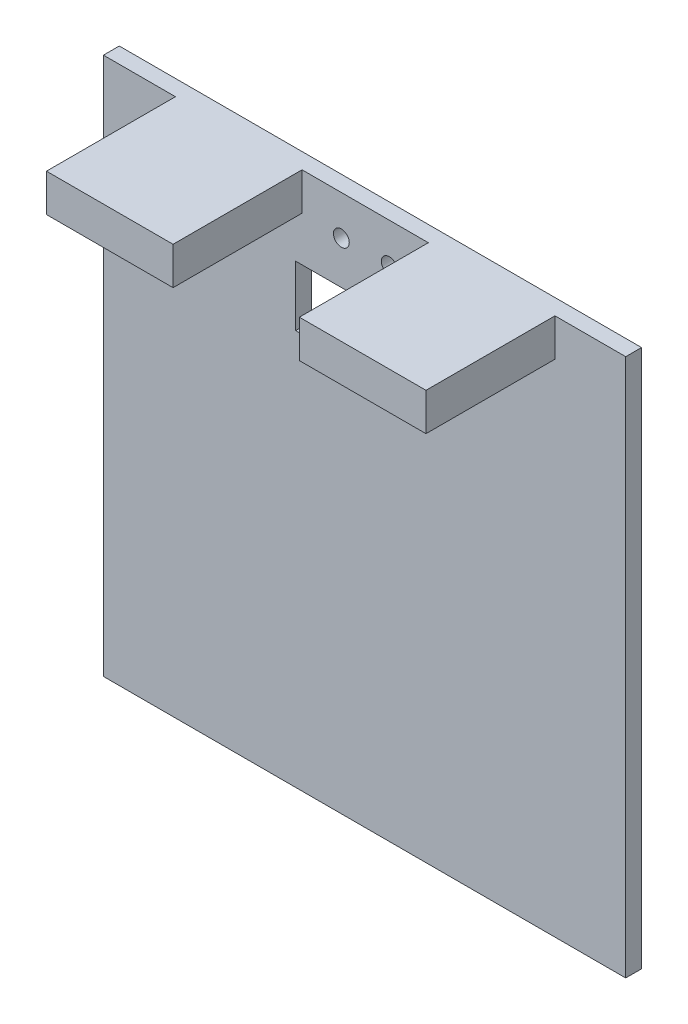
ISO-10303-21;
HEADER;
FILE_DESCRIPTION(('STEP AP214'),'2;1');
FILE_NAME('part.step','',(''),(''),'','','');
FILE_SCHEMA(('AUTOMOTIVE_DESIGN { 1 0 10303 214 1 1 1 1 }'));
ENDSEC;
DATA;
#1=APPLICATION_CONTEXT('core data for automotive mechanical design processes');
#2=APPLICATION_PROTOCOL_DEFINITION('international standard','automotive_design',2000,#1);
#3=PRODUCT_CONTEXT('',#1,'mechanical');
#4=PRODUCT('Part','Part','',(#3));
#5=PRODUCT_RELATED_PRODUCT_CATEGORY('part','',(#4));
#6=PRODUCT_DEFINITION_FORMATION('','',#4);
#7=PRODUCT_DEFINITION_CONTEXT('part definition',#1,'design');
#8=PRODUCT_DEFINITION('design','',#6,#7);
#9=PRODUCT_DEFINITION_SHAPE('','',#8);
#10=(LENGTH_UNIT() NAMED_UNIT(*) SI_UNIT(.MILLI.,.METRE.));
#11=(NAMED_UNIT(*) PLANE_ANGLE_UNIT() SI_UNIT($,.RADIAN.));
#12=(NAMED_UNIT(*) SI_UNIT($,.STERADIAN.) SOLID_ANGLE_UNIT());
#13=UNCERTAINTY_MEASURE_WITH_UNIT(LENGTH_MEASURE(1.E-05),#10,'distance_accuracy_value','');
#14=(GEOMETRIC_REPRESENTATION_CONTEXT(3) GLOBAL_UNCERTAINTY_ASSIGNED_CONTEXT((#13)) GLOBAL_UNIT_ASSIGNED_CONTEXT((#10,
#11,#12)) REPRESENTATION_CONTEXT('',''));
#15=CARTESIAN_POINT('',(0.,0.,0.));
#16=DIRECTION('',(0.,0.,1.));
#17=DIRECTION('',(1.,0.,0.));
#18=AXIS2_PLACEMENT_3D('',#15,#16,#17);
#19=CARTESIAN_POINT('',(0.,0.,32.));
#20=DIRECTION('',(0.,0.,1.));
#21=DIRECTION('',(1.,0.,0.));
#22=AXIS2_PLACEMENT_3D('',#19,#20,#21);
#23=PLANE('',#22);
#24=CARTESIAN_POINT('',(249.003592831073,330.031505481251,32.));
#25=DIRECTION('',(0.,0.,1.));
#26=DIRECTION('',(1.,0.,0.));
#27=AXIS2_PLACEMENT_3D('',#24,#25,#26);
#28=CIRCLE('',#27,0.999999999999998);
#29=CARTESIAN_POINT('',(250.003592831073,330.031505481251,32.));
#30=VERTEX_POINT('',#29);
#31=EDGE_CURVE('E276',#30,#30,#28,.T.);
#32=ORIENTED_EDGE('',*,*,#31,.F.);
#33=EDGE_LOOP('',(#32));
#34=FACE_BOUND('',#33,.T.);
#35=CARTESIAN_POINT('',(255.05528253112,330.031505481251,32.));
#36=DIRECTION('',(0.,0.,1.));
#37=DIRECTION('',(1.,0.,0.));
#38=AXIS2_PLACEMENT_3D('',#35,#36,#37);
#39=CIRCLE('',#38,0.999999999999998);
#40=CARTESIAN_POINT('',(256.05528253112,330.031505481251,32.));
#41=VERTEX_POINT('',#40);
#42=EDGE_CURVE('E268',#41,#41,#39,.T.);
#43=ORIENTED_EDGE('',*,*,#42,.F.);
#44=EDGE_LOOP('',(#43));
#45=FACE_BOUND('',#44,.T.);
#46=DIRECTION('',(1.,0.,0.));
#47=VECTOR('',#46,1.);
#48=CARTESIAN_POINT('',(243.235035756278,317.023888470709,32.));
#49=LINE('',#48,#47);
#50=CARTESIAN_POINT('',(243.235035756278,317.023888470709,32.));
#51=VERTEX_POINT('',#50);
#52=CARTESIAN_POINT('',(261.035035756278,317.023888470709,32.));
#53=VERTEX_POINT('',#52);
#54=EDGE_CURVE('E228',#51,#53,#49,.T.);
#55=ORIENTED_EDGE('',*,*,#54,.F.);
#56=DIRECTION('',(0.,-1.,0.));
#57=VECTOR('',#56,1.);
#58=CARTESIAN_POINT('',(243.235035756278,324.623888470709,32.));
#59=LINE('',#58,#57);
#60=CARTESIAN_POINT('',(243.235035756278,324.623888470709,32.));
#61=VERTEX_POINT('',#60);
#62=EDGE_CURVE('E225',#61,#51,#59,.T.);
#63=ORIENTED_EDGE('',*,*,#62,.F.);
#64=DIRECTION('',(-1.,0.,0.));
#65=VECTOR('',#64,1.);
#66=CARTESIAN_POINT('',(243.235035756278,324.623888470709,32.));
#67=LINE('',#66,#65);
#68=CARTESIAN_POINT('',(261.035035756278,324.623888470709,32.));
#69=VERTEX_POINT('',#68);
#70=EDGE_CURVE('E236',#69,#61,#67,.T.);
#71=ORIENTED_EDGE('',*,*,#70,.F.);
#72=DIRECTION('',(0.,1.,0.));
#73=VECTOR('',#72,1.);
#74=CARTESIAN_POINT('',(261.035035756278,324.623888470709,32.));
#75=LINE('',#74,#73);
#76=EDGE_CURVE('E232',#53,#69,#75,.T.);
#77=ORIENTED_EDGE('',*,*,#76,.F.);
#78=EDGE_LOOP('',(#55,#63,#71,#77));
#79=FACE_BOUND('',#78,.T.);
#80=DIRECTION('',(-1.,0.,0.));
#81=VECTOR('',#80,1.);
#82=CARTESIAN_POINT('',(218.940861289367,335.024014524093,32.));
#83=LINE('',#82,#81);
#84=CARTESIAN_POINT('',(284.940861289367,335.024014524093,32.));
#85=VERTEX_POINT('',#84);
#86=CARTESIAN_POINT('',(276.,335.024014524093,32.));
#87=VERTEX_POINT('',#86);
#88=EDGE_CURVE('E296',#85,#87,#83,.T.);
#89=ORIENTED_EDGE('',*,*,#88,.T.);
#90=DIRECTION('',(0.,1.,0.));
#91=VECTOR('',#90,1.);
#92=CARTESIAN_POINT('',(276.,330.274014524093,32.));
#93=LINE('',#92,#91);
#94=CARTESIAN_POINT('',(276.,330.274014524093,32.));
#95=VERTEX_POINT('',#94);
#96=EDGE_CURVE('E60',#95,#87,#93,.T.);
#97=ORIENTED_EDGE('',*,*,#96,.F.);
#98=DIRECTION('',(1.,0.,0.));
#99=VECTOR('',#98,1.);
#100=CARTESIAN_POINT('',(276.,330.274014524093,32.));
#101=LINE('',#100,#99);
#102=CARTESIAN_POINT('',(260.,330.274014524093,32.));
#103=VERTEX_POINT('',#102);
#104=EDGE_CURVE('E55',#103,#95,#101,.T.);
#105=ORIENTED_EDGE('',*,*,#104,.F.);
#106=DIRECTION('',(0.,-1.,0.));
#107=VECTOR('',#106,1.);
#108=CARTESIAN_POINT('',(260.,330.274014524093,32.));
#109=LINE('',#108,#107);
#110=CARTESIAN_POINT('',(260.,335.024014524093,32.));
#111=VERTEX_POINT('',#110);
#112=EDGE_CURVE('E340',#111,#103,#109,.T.);
#113=ORIENTED_EDGE('',*,*,#112,.F.);
#114=CARTESIAN_POINT('',(244.037971241822,335.024014524093,32.));
#115=VERTEX_POINT('',#114);
#116=EDGE_CURVE('E300',#111,#115,#83,.T.);
#117=ORIENTED_EDGE('',*,*,#116,.T.);
#118=DIRECTION('',(0.,1.,0.));
#119=VECTOR('',#118,1.);
#120=CARTESIAN_POINT('',(244.037971241822,330.274014524093,32.));
#121=LINE('',#120,#119);
#122=CARTESIAN_POINT('',(244.037971241822,330.274014524093,32.));
#123=VERTEX_POINT('',#122);
#124=EDGE_CURVE('E177',#123,#115,#121,.T.);
#125=ORIENTED_EDGE('',*,*,#124,.F.);
#126=DIRECTION('',(1.,0.,0.));
#127=VECTOR('',#126,1.);
#128=CARTESIAN_POINT('',(244.037971241822,330.274014524093,32.));
#129=LINE('',#128,#127);
#130=CARTESIAN_POINT('',(228.037971241822,330.274014524093,32.));
#131=VERTEX_POINT('',#130);
#132=EDGE_CURVE('E193',#131,#123,#129,.T.);
#133=ORIENTED_EDGE('',*,*,#132,.F.);
#134=DIRECTION('',(0.,-1.,0.));
#135=VECTOR('',#134,1.);
#136=CARTESIAN_POINT('',(228.037971241822,330.274014524093,32.));
#137=LINE('',#136,#135);
#138=CARTESIAN_POINT('',(228.037971241822,335.024014524093,32.));
#139=VERTEX_POINT('',#138);
#140=EDGE_CURVE('E182',#139,#131,#137,.T.);
#141=ORIENTED_EDGE('',*,*,#140,.F.);
#142=CARTESIAN_POINT('',(218.940861289367,335.024014524093,32.));
#143=VERTEX_POINT('',#142);
#144=EDGE_CURVE('E295',#139,#143,#83,.T.);
#145=ORIENTED_EDGE('',*,*,#144,.T.);
#146=DIRECTION('',(0.,-1.,0.));
#147=VECTOR('',#146,1.);
#148=CARTESIAN_POINT('',(218.940861289367,335.024014524093,32.));
#149=LINE('',#148,#147);
#150=CARTESIAN_POINT('',(218.940861289367,267.024014524093,32.));
#151=VERTEX_POINT('',#150);
#152=EDGE_CURVE('E284',#143,#151,#149,.T.);
#153=ORIENTED_EDGE('',*,*,#152,.T.);
#154=DIRECTION('',(1.,0.,0.));
#155=VECTOR('',#154,1.);
#156=CARTESIAN_POINT('',(218.940861289367,267.024014524093,32.));
#157=LINE('',#156,#155);
#158=CARTESIAN_POINT('',(284.940861289367,267.024014524093,32.));
#159=VERTEX_POINT('',#158);
#160=EDGE_CURVE('E288',#151,#159,#157,.T.);
#161=ORIENTED_EDGE('',*,*,#160,.T.);
#162=DIRECTION('',(0.,1.,0.));
#163=VECTOR('',#162,1.);
#164=CARTESIAN_POINT('',(284.940861289367,335.024014524093,32.));
#165=LINE('',#164,#163);
#166=EDGE_CURVE('E292',#159,#85,#165,.T.);
#167=ORIENTED_EDGE('',*,*,#166,.T.);
#168=EDGE_LOOP('',(#89,#97,#105,#113,#117,#125,#133,#141,#145,#153,#161,#167));
#169=FACE_BOUND('',#168,.T.);
#170=ADVANCED_FACE('F39',(#34,#45,#79,#169),#23,.T.);
#171=CARTESIAN_POINT('',(0.,0.,30.));
#172=DIRECTION('',(0.,0.,1.));
#173=DIRECTION('',(1.,0.,0.));
#174=AXIS2_PLACEMENT_3D('',#171,#172,#173);
#175=PLANE('',#174);
#176=CARTESIAN_POINT('',(255.05528253112,330.031505481251,30.));
#177=DIRECTION('',(0.,0.,1.));
#178=DIRECTION('',(1.,0.,0.));
#179=AXIS2_PLACEMENT_3D('',#176,#177,#178);
#180=CIRCLE('',#179,0.999999999999998);
#181=CARTESIAN_POINT('',(256.05528253112,330.031505481251,30.));
#182=VERTEX_POINT('',#181);
#183=EDGE_CURVE('E267',#182,#182,#180,.T.);
#184=ORIENTED_EDGE('',*,*,#183,.T.);
#185=EDGE_LOOP('',(#184));
#186=FACE_BOUND('',#185,.T.);
#187=CARTESIAN_POINT('',(249.003592831073,330.031505481251,30.));
#188=DIRECTION('',(0.,0.,1.));
#189=DIRECTION('',(1.,0.,0.));
#190=AXIS2_PLACEMENT_3D('',#187,#188,#189);
#191=CIRCLE('',#190,0.999999999999998);
#192=CARTESIAN_POINT('',(250.003592831073,330.031505481251,30.));
#193=VERTEX_POINT('',#192);
#194=EDGE_CURVE('E272',#193,#193,#191,.T.);
#195=ORIENTED_EDGE('',*,*,#194,.T.);
#196=EDGE_LOOP('',(#195));
#197=FACE_BOUND('',#196,.T.);
#198=DIRECTION('',(0.,-1.,0.));
#199=VECTOR('',#198,1.);
#200=CARTESIAN_POINT('',(218.940861289367,335.024014524093,30.));
#201=LINE('',#200,#199);
#202=CARTESIAN_POINT('',(218.940861289367,335.024014524093,30.));
#203=VERTEX_POINT('',#202);
#204=CARTESIAN_POINT('',(218.940861289367,267.024014524093,30.));
#205=VERTEX_POINT('',#204);
#206=EDGE_CURVE('E280',#203,#205,#201,.T.);
#207=ORIENTED_EDGE('',*,*,#206,.F.);
#208=DIRECTION('',(-1.,0.,0.));
#209=VECTOR('',#208,1.);
#210=CARTESIAN_POINT('',(218.940861289367,335.024014524093,30.));
#211=LINE('',#210,#209);
#212=CARTESIAN_POINT('',(284.940861289367,335.024014524093,30.));
#213=VERTEX_POINT('',#212);
#214=EDGE_CURVE('E289',#213,#203,#211,.T.);
#215=ORIENTED_EDGE('',*,*,#214,.F.);
#216=DIRECTION('',(0.,1.,0.));
#217=VECTOR('',#216,1.);
#218=CARTESIAN_POINT('',(284.940861289367,335.024014524093,30.));
#219=LINE('',#218,#217);
#220=CARTESIAN_POINT('',(284.940861289367,267.024014524093,30.));
#221=VERTEX_POINT('',#220);
#222=EDGE_CURVE('E307',#221,#213,#219,.T.);
#223=ORIENTED_EDGE('',*,*,#222,.F.);
#224=DIRECTION('',(1.,0.,0.));
#225=VECTOR('',#224,1.);
#226=CARTESIAN_POINT('',(218.940861289367,267.024014524093,30.));
#227=LINE('',#226,#225);
#228=EDGE_CURVE('E304',#205,#221,#227,.T.);
#229=ORIENTED_EDGE('',*,*,#228,.F.);
#230=EDGE_LOOP('',(#207,#215,#223,#229));
#231=FACE_BOUND('',#230,.T.);
#232=DIRECTION('',(0.,-1.,0.));
#233=VECTOR('',#232,1.);
#234=CARTESIAN_POINT('',(243.235035756278,324.623888470709,30.));
#235=LINE('',#234,#233);
#236=CARTESIAN_POINT('',(243.235035756278,324.623888470709,30.));
#237=VERTEX_POINT('',#236);
#238=CARTESIAN_POINT('',(243.235035756278,317.023888470709,30.));
#239=VERTEX_POINT('',#238);
#240=EDGE_CURVE('E224',#237,#239,#235,.T.);
#241=ORIENTED_EDGE('',*,*,#240,.T.);
#242=DIRECTION('',(1.,0.,0.));
#243=VECTOR('',#242,1.);
#244=CARTESIAN_POINT('',(243.235035756278,317.023888470709,30.));
#245=LINE('',#244,#243);
#246=CARTESIAN_POINT('',(261.035035756278,317.023888470709,30.));
#247=VERTEX_POINT('',#246);
#248=EDGE_CURVE('E243',#239,#247,#245,.T.);
#249=ORIENTED_EDGE('',*,*,#248,.T.);
#250=DIRECTION('',(0.,1.,0.));
#251=VECTOR('',#250,1.);
#252=CARTESIAN_POINT('',(261.035035756278,324.623888470709,30.));
#253=LINE('',#252,#251);
#254=CARTESIAN_POINT('',(261.035035756278,324.623888470709,30.));
#255=VERTEX_POINT('',#254);
#256=EDGE_CURVE('E247',#247,#255,#253,.T.);
#257=ORIENTED_EDGE('',*,*,#256,.T.);
#258=DIRECTION('',(-1.,0.,0.));
#259=VECTOR('',#258,1.);
#260=CARTESIAN_POINT('',(243.235035756278,324.623888470709,30.));
#261=LINE('',#260,#259);
#262=EDGE_CURVE('E229',#255,#237,#261,.T.);
#263=ORIENTED_EDGE('',*,*,#262,.T.);
#264=EDGE_LOOP('',(#241,#249,#257,#263));
#265=FACE_BOUND('',#264,.T.);
#266=ADVANCED_FACE('F330',(#186,#197,#231,#265),#175,.F.);
#267=CARTESIAN_POINT('',(218.940861289367,335.024014524093,32.));
#268=DIRECTION('',(1.,0.,0.));
#269=DIRECTION('',(0.,0.,-1.));
#270=AXIS2_PLACEMENT_3D('',#267,#268,#269);
#271=PLANE('',#270);
#272=ORIENTED_EDGE('',*,*,#206,.T.);
#273=DIRECTION('',(0.,0.,-1.));
#274=VECTOR('',#273,1.);
#275=CARTESIAN_POINT('',(218.940861289367,267.024014524093,32.));
#276=LINE('',#275,#274);
#277=EDGE_CURVE('E11',#151,#205,#276,.T.);
#278=ORIENTED_EDGE('',*,*,#277,.F.);
#279=ORIENTED_EDGE('',*,*,#152,.F.);
#280=DIRECTION('',(0.,0.,-1.));
#281=VECTOR('',#280,1.);
#282=CARTESIAN_POINT('',(218.940861289367,335.024014524093,32.));
#283=LINE('',#282,#281);
#284=EDGE_CURVE('E299',#143,#203,#283,.T.);
#285=ORIENTED_EDGE('',*,*,#284,.T.);
#286=EDGE_LOOP('',(#272,#278,#279,#285));
#287=FACE_BOUND('',#286,.T.);
#288=ADVANCED_FACE('F41',(#287),#271,.F.);
#289=CARTESIAN_POINT('',(218.940861289367,267.024014524093,32.));
#290=DIRECTION('',(0.,1.,0.));
#291=DIRECTION('',(0.,0.,1.));
#292=AXIS2_PLACEMENT_3D('',#289,#290,#291);
#293=PLANE('',#292);
#294=ORIENTED_EDGE('',*,*,#228,.T.);
#295=DIRECTION('',(0.,0.,-1.));
#296=VECTOR('',#295,1.);
#297=CARTESIAN_POINT('',(284.940861289367,267.024014524093,32.));
#298=LINE('',#297,#296);
#299=EDGE_CURVE('E48',#159,#221,#298,.T.);
#300=ORIENTED_EDGE('',*,*,#299,.F.);
#301=ORIENTED_EDGE('',*,*,#160,.F.);
#302=ORIENTED_EDGE('',*,*,#277,.T.);
#303=EDGE_LOOP('',(#294,#300,#301,#302));
#304=FACE_BOUND('',#303,.T.);
#305=ADVANCED_FACE('F383',(#304),#293,.F.);
#306=CARTESIAN_POINT('',(284.940861289367,335.024014524093,32.));
#307=DIRECTION('',(-1.,0.,0.));
#308=DIRECTION('',(0.,-1.,0.));
#309=AXIS2_PLACEMENT_3D('',#306,#307,#308);
#310=PLANE('',#309);
#311=ORIENTED_EDGE('',*,*,#222,.T.);
#312=DIRECTION('',(0.,0.,-1.));
#313=VECTOR('',#312,1.);
#314=CARTESIAN_POINT('',(284.940861289367,335.024014524093,32.));
#315=LINE('',#314,#313);
#316=EDGE_CURVE('E315',#85,#213,#315,.T.);
#317=ORIENTED_EDGE('',*,*,#316,.F.);
#318=ORIENTED_EDGE('',*,*,#166,.F.);
#319=ORIENTED_EDGE('',*,*,#299,.T.);
#320=EDGE_LOOP('',(#311,#317,#318,#319));
#321=FACE_BOUND('',#320,.T.);
#322=ADVANCED_FACE('F324',(#321),#310,.F.);
#323=CARTESIAN_POINT('',(218.940861289367,335.024014524093,32.));
#324=DIRECTION('',(0.,-1.,0.));
#325=DIRECTION('',(1.,0.,0.));
#326=AXIS2_PLACEMENT_3D('',#323,#324,#325);
#327=PLANE('',#326);
#328=ORIENTED_EDGE('',*,*,#214,.T.);
#329=ORIENTED_EDGE('',*,*,#284,.F.);
#330=ORIENTED_EDGE('',*,*,#144,.F.);
#331=DIRECTION('',(0.,0.,-1.));
#332=VECTOR('',#331,1.);
#333=CARTESIAN_POINT('',(228.037971241822,335.024014524093,48.3));
#334=LINE('',#333,#332);
#335=CARTESIAN_POINT('',(228.037971241822,335.024014524093,48.3));
#336=VERTEX_POINT('',#335);
#337=EDGE_CURVE('E216',#336,#139,#334,.T.);
#338=ORIENTED_EDGE('',*,*,#337,.F.);
#339=DIRECTION('',(-1.,0.,0.));
#340=VECTOR('',#339,1.);
#341=CARTESIAN_POINT('',(244.037971241822,335.024014524093,48.3));
#342=LINE('',#341,#340);
#343=CARTESIAN_POINT('',(244.037971241822,335.024014524093,48.3));
#344=VERTEX_POINT('',#343);
#345=EDGE_CURVE('E192',#344,#336,#342,.T.);
#346=ORIENTED_EDGE('',*,*,#345,.F.);
#347=DIRECTION('',(0.,0.,-1.));
#348=VECTOR('',#347,1.);
#349=CARTESIAN_POINT('',(244.037971241822,335.024014524093,48.3));
#350=LINE('',#349,#348);
#351=EDGE_CURVE('E220',#344,#115,#350,.T.);
#352=ORIENTED_EDGE('',*,*,#351,.T.);
#353=ORIENTED_EDGE('',*,*,#116,.F.);
#354=DIRECTION('',(0.,0.,-1.));
#355=VECTOR('',#354,1.);
#356=CARTESIAN_POINT('',(260.,335.024014524093,48.3));
#357=LINE('',#356,#355);
#358=CARTESIAN_POINT('',(260.,335.024014524093,48.3));
#359=VERTEX_POINT('',#358);
#360=EDGE_CURVE('E159',#359,#111,#357,.T.);
#361=ORIENTED_EDGE('',*,*,#360,.F.);
#362=DIRECTION('',(-1.,0.,0.));
#363=VECTOR('',#362,1.);
#364=CARTESIAN_POINT('',(276.,335.024014524093,48.3));
#365=LINE('',#364,#363);
#366=CARTESIAN_POINT('',(276.,335.024014524093,48.3));
#367=VERTEX_POINT('',#366);
#368=EDGE_CURVE('E152',#367,#359,#365,.T.);
#369=ORIENTED_EDGE('',*,*,#368,.F.);
#370=DIRECTION('',(0.,0.,-1.));
#371=VECTOR('',#370,1.);
#372=CARTESIAN_POINT('',(276.,335.024014524093,48.3));
#373=LINE('',#372,#371);
#374=EDGE_CURVE('E157',#367,#87,#373,.T.);
#375=ORIENTED_EDGE('',*,*,#374,.T.);
#376=ORIENTED_EDGE('',*,*,#88,.F.);
#377=ORIENTED_EDGE('',*,*,#316,.T.);
#378=EDGE_LOOP('',(#328,#329,#330,#338,#346,#352,#353,#361,#369,#375,#376,#377));
#379=FACE_BOUND('',#378,.T.);
#380=ADVANCED_FACE('F154',(#379),#327,.F.);
#381=CARTESIAN_POINT('',(249.003592831073,330.031505481251,32.));
#382=DIRECTION('',(0.,0.,-1.));
#383=DIRECTION('',(-1.,0.,0.));
#384=AXIS2_PLACEMENT_3D('',#381,#382,#383);
#385=CYLINDRICAL_SURFACE('',#384,0.999999999999998);
#386=ORIENTED_EDGE('',*,*,#31,.T.);
#387=EDGE_LOOP('',(#386));
#388=FACE_BOUND('',#387,.T.);
#389=ORIENTED_EDGE('',*,*,#194,.F.);
#390=EDGE_LOOP('',(#389));
#391=FACE_BOUND('',#390,.T.);
#392=ADVANCED_FACE('F377',(#388,#391),#385,.F.);
#393=CARTESIAN_POINT('',(255.05528253112,330.031505481251,32.));
#394=DIRECTION('',(0.,0.,-1.));
#395=DIRECTION('',(-1.,0.,0.));
#396=AXIS2_PLACEMENT_3D('',#393,#394,#395);
#397=CYLINDRICAL_SURFACE('',#396,0.999999999999998);
#398=ORIENTED_EDGE('',*,*,#42,.T.);
#399=EDGE_LOOP('',(#398));
#400=FACE_BOUND('',#399,.T.);
#401=ORIENTED_EDGE('',*,*,#183,.F.);
#402=EDGE_LOOP('',(#401));
#403=FACE_BOUND('',#402,.T.);
#404=ADVANCED_FACE('F422',(#400,#403),#397,.F.);
#405=CARTESIAN_POINT('',(243.235035756278,324.623888470709,32.));
#406=DIRECTION('',(1.,0.,0.));
#407=DIRECTION('',(0.,1.,0.));
#408=AXIS2_PLACEMENT_3D('',#405,#406,#407);
#409=PLANE('',#408);
#410=ORIENTED_EDGE('',*,*,#240,.F.);
#411=DIRECTION('',(0.,0.,-1.));
#412=VECTOR('',#411,1.);
#413=CARTESIAN_POINT('',(243.235035756278,324.623888470709,32.));
#414=LINE('',#413,#412);
#415=EDGE_CURVE('E239',#61,#237,#414,.T.);
#416=ORIENTED_EDGE('',*,*,#415,.F.);
#417=ORIENTED_EDGE('',*,*,#62,.T.);
#418=DIRECTION('',(0.,0.,-1.));
#419=VECTOR('',#418,1.);
#420=CARTESIAN_POINT('',(243.235035756278,317.023888470709,32.));
#421=LINE('',#420,#419);
#422=EDGE_CURVE('E263',#51,#239,#421,.T.);
#423=ORIENTED_EDGE('',*,*,#422,.T.);
#424=EDGE_LOOP('',(#410,#416,#417,#423));
#425=FACE_BOUND('',#424,.T.);
#426=ADVANCED_FACE('F430',(#425),#409,.T.);
#427=CARTESIAN_POINT('',(243.235035756278,317.023888470709,32.));
#428=DIRECTION('',(0.,1.,0.));
#429=DIRECTION('',(0.,0.,1.));
#430=AXIS2_PLACEMENT_3D('',#427,#428,#429);
#431=PLANE('',#430);
#432=ORIENTED_EDGE('',*,*,#248,.F.);
#433=ORIENTED_EDGE('',*,*,#422,.F.);
#434=ORIENTED_EDGE('',*,*,#54,.T.);
#435=DIRECTION('',(0.,0.,-1.));
#436=VECTOR('',#435,1.);
#437=CARTESIAN_POINT('',(261.035035756278,317.023888470709,32.));
#438=LINE('',#437,#436);
#439=EDGE_CURVE('E260',#53,#247,#438,.T.);
#440=ORIENTED_EDGE('',*,*,#439,.T.);
#441=EDGE_LOOP('',(#432,#433,#434,#440));
#442=FACE_BOUND('',#441,.T.);
#443=ADVANCED_FACE('F438',(#442),#431,.T.);
#444=CARTESIAN_POINT('',(261.035035756278,324.623888470709,32.));
#445=DIRECTION('',(-1.,0.,0.));
#446=DIRECTION('',(0.,0.,1.));
#447=AXIS2_PLACEMENT_3D('',#444,#445,#446);
#448=PLANE('',#447);
#449=ORIENTED_EDGE('',*,*,#256,.F.);
#450=ORIENTED_EDGE('',*,*,#439,.F.);
#451=ORIENTED_EDGE('',*,*,#76,.T.);
#452=DIRECTION('',(0.,0.,-1.));
#453=VECTOR('',#452,1.);
#454=CARTESIAN_POINT('',(261.035035756278,324.623888470709,32.));
#455=LINE('',#454,#453);
#456=EDGE_CURVE('E257',#69,#255,#455,.T.);
#457=ORIENTED_EDGE('',*,*,#456,.T.);
#458=EDGE_LOOP('',(#449,#450,#451,#457));
#459=FACE_BOUND('',#458,.T.);
#460=ADVANCED_FACE('F447',(#459),#448,.T.);
#461=CARTESIAN_POINT('',(243.235035756278,324.623888470709,32.));
#462=DIRECTION('',(0.,-1.,0.));
#463=DIRECTION('',(0.,0.,-1.));
#464=AXIS2_PLACEMENT_3D('',#461,#462,#463);
#465=PLANE('',#464);
#466=ORIENTED_EDGE('',*,*,#262,.F.);
#467=ORIENTED_EDGE('',*,*,#456,.F.);
#468=ORIENTED_EDGE('',*,*,#70,.T.);
#469=ORIENTED_EDGE('',*,*,#415,.T.);
#470=EDGE_LOOP('',(#466,#467,#468,#469));
#471=FACE_BOUND('',#470,.T.);
#472=ADVANCED_FACE('F456',(#471),#465,.T.);
#473=CARTESIAN_POINT('',(244.037971241822,330.274014524093,48.3));
#474=DIRECTION('',(-1.,0.,0.));
#475=DIRECTION('',(0.,0.,1.));
#476=AXIS2_PLACEMENT_3D('',#473,#474,#475);
#477=PLANE('',#476);
#478=ORIENTED_EDGE('',*,*,#124,.T.);
#479=ORIENTED_EDGE('',*,*,#351,.F.);
#480=DIRECTION('',(0.,1.,0.));
#481=VECTOR('',#480,1.);
#482=CARTESIAN_POINT('',(244.037971241822,330.274014524093,48.3));
#483=LINE('',#482,#481);
#484=CARTESIAN_POINT('',(244.037971241822,330.274014524093,48.3));
#485=VERTEX_POINT('',#484);
#486=EDGE_CURVE('E188',#485,#344,#483,.T.);
#487=ORIENTED_EDGE('',*,*,#486,.F.);
#488=DIRECTION('',(0.,0.,-1.));
#489=VECTOR('',#488,1.);
#490=CARTESIAN_POINT('',(244.037971241822,330.274014524093,48.3));
#491=LINE('',#490,#489);
#492=EDGE_CURVE('E201',#485,#123,#491,.T.);
#493=ORIENTED_EDGE('',*,*,#492,.T.);
#494=EDGE_LOOP('',(#478,#479,#487,#493));
#495=FACE_BOUND('',#494,.T.);
#496=ADVANCED_FACE('F344',(#495),#477,.F.);
#497=CARTESIAN_POINT('',(228.037971241822,330.274014524093,48.3));
#498=DIRECTION('',(1.,0.,0.));
#499=DIRECTION('',(0.,0.,-1.));
#500=AXIS2_PLACEMENT_3D('',#497,#498,#499);
#501=PLANE('',#500);
#502=ORIENTED_EDGE('',*,*,#140,.T.);
#503=DIRECTION('',(0.,0.,-1.));
#504=VECTOR('',#503,1.);
#505=CARTESIAN_POINT('',(228.037971241822,330.274014524093,48.3));
#506=LINE('',#505,#504);
#507=CARTESIAN_POINT('',(228.037971241822,330.274014524093,48.3));
#508=VERTEX_POINT('',#507);
#509=EDGE_CURVE('E212',#508,#131,#506,.T.);
#510=ORIENTED_EDGE('',*,*,#509,.F.);
#511=DIRECTION('',(0.,-1.,0.));
#512=VECTOR('',#511,1.);
#513=CARTESIAN_POINT('',(228.037971241822,330.274014524093,48.3));
#514=LINE('',#513,#512);
#515=EDGE_CURVE('E196',#336,#508,#514,.T.);
#516=ORIENTED_EDGE('',*,*,#515,.F.);
#517=ORIENTED_EDGE('',*,*,#337,.T.);
#518=EDGE_LOOP('',(#502,#510,#516,#517));
#519=FACE_BOUND('',#518,.T.);
#520=ADVANCED_FACE('F351',(#519),#501,.F.);
#521=CARTESIAN_POINT('',(244.037971241822,330.274014524093,48.3));
#522=DIRECTION('',(0.,1.,0.));
#523=DIRECTION('',(0.,0.,1.));
#524=AXIS2_PLACEMENT_3D('',#521,#522,#523);
#525=PLANE('',#524);
#526=ORIENTED_EDGE('',*,*,#132,.T.);
#527=ORIENTED_EDGE('',*,*,#492,.F.);
#528=DIRECTION('',(1.,0.,0.));
#529=VECTOR('',#528,1.);
#530=CARTESIAN_POINT('',(244.037971241822,330.274014524093,48.3));
#531=LINE('',#530,#529);
#532=EDGE_CURVE('E199',#508,#485,#531,.T.);
#533=ORIENTED_EDGE('',*,*,#532,.F.);
#534=ORIENTED_EDGE('',*,*,#509,.T.);
#535=EDGE_LOOP('',(#526,#527,#533,#534));
#536=FACE_BOUND('',#535,.T.);
#537=ADVANCED_FACE('F348',(#536),#525,.F.);
#538=CARTESIAN_POINT('',(0.,0.,48.3));
#539=DIRECTION('',(0.,0.,1.));
#540=DIRECTION('',(1.,0.,0.));
#541=AXIS2_PLACEMENT_3D('',#538,#539,#540);
#542=PLANE('',#541);
#543=ORIENTED_EDGE('',*,*,#486,.T.);
#544=ORIENTED_EDGE('',*,*,#345,.T.);
#545=ORIENTED_EDGE('',*,*,#515,.T.);
#546=ORIENTED_EDGE('',*,*,#532,.T.);
#547=EDGE_LOOP('',(#543,#544,#545,#546));
#548=FACE_BOUND('',#547,.T.);
#549=ADVANCED_FACE('F354',(#548),#542,.T.);
#550=CARTESIAN_POINT('',(276.,330.274014524093,48.3));
#551=DIRECTION('',(-1.,0.,0.));
#552=DIRECTION('',(0.,0.,1.));
#553=AXIS2_PLACEMENT_3D('',#550,#551,#552);
#554=PLANE('',#553);
#555=ORIENTED_EDGE('',*,*,#96,.T.);
#556=ORIENTED_EDGE('',*,*,#374,.F.);
#557=DIRECTION('',(0.,1.,0.));
#558=VECTOR('',#557,1.);
#559=CARTESIAN_POINT('',(276.,330.274014524093,48.3));
#560=LINE('',#559,#558);
#561=CARTESIAN_POINT('',(276.,330.274014524093,48.3));
#562=VERTEX_POINT('',#561);
#563=EDGE_CURVE('E164',#562,#367,#560,.T.);
#564=ORIENTED_EDGE('',*,*,#563,.F.);
#565=DIRECTION('',(0.,0.,-1.));
#566=VECTOR('',#565,1.);
#567=CARTESIAN_POINT('',(276.,330.274014524093,48.3));
#568=LINE('',#567,#566);
#569=EDGE_CURVE('E529',#562,#95,#568,.T.);
#570=ORIENTED_EDGE('',*,*,#569,.T.);
#571=EDGE_LOOP('',(#555,#556,#564,#570));
#572=FACE_BOUND('',#571,.T.);
#573=ADVANCED_FACE('F175',(#572),#554,.F.);
#574=CARTESIAN_POINT('',(260.,330.274014524093,48.3));
#575=DIRECTION('',(1.,0.,0.));
#576=DIRECTION('',(0.,0.,-1.));
#577=AXIS2_PLACEMENT_3D('',#574,#575,#576);
#578=PLANE('',#577);
#579=ORIENTED_EDGE('',*,*,#112,.T.);
#580=DIRECTION('',(0.,0.,-1.));
#581=VECTOR('',#580,1.);
#582=CARTESIAN_POINT('',(260.,330.274014524093,48.3));
#583=LINE('',#582,#581);
#584=CARTESIAN_POINT('',(260.,330.274014524093,48.3));
#585=VERTEX_POINT('',#584);
#586=EDGE_CURVE('E184',#585,#103,#583,.T.);
#587=ORIENTED_EDGE('',*,*,#586,.F.);
#588=DIRECTION('',(0.,-1.,0.));
#589=VECTOR('',#588,1.);
#590=CARTESIAN_POINT('',(260.,330.274014524093,48.3));
#591=LINE('',#590,#589);
#592=EDGE_CURVE('E163',#359,#585,#591,.T.);
#593=ORIENTED_EDGE('',*,*,#592,.F.);
#594=ORIENTED_EDGE('',*,*,#360,.T.);
#595=EDGE_LOOP('',(#579,#587,#593,#594));
#596=FACE_BOUND('',#595,.T.);
#597=ADVANCED_FACE('F361',(#596),#578,.F.);
#598=CARTESIAN_POINT('',(276.,330.274014524093,48.3));
#599=DIRECTION('',(0.,1.,0.));
#600=DIRECTION('',(0.,0.,1.));
#601=AXIS2_PLACEMENT_3D('',#598,#599,#600);
#602=PLANE('',#601);
#603=ORIENTED_EDGE('',*,*,#104,.T.);
#604=ORIENTED_EDGE('',*,*,#569,.F.);
#605=DIRECTION('',(1.,0.,0.));
#606=VECTOR('',#605,1.);
#607=CARTESIAN_POINT('',(276.,330.274014524093,48.3));
#608=LINE('',#607,#606);
#609=EDGE_CURVE('E169',#585,#562,#608,.T.);
#610=ORIENTED_EDGE('',*,*,#609,.F.);
#611=ORIENTED_EDGE('',*,*,#586,.T.);
#612=EDGE_LOOP('',(#603,#604,#610,#611));
#613=FACE_BOUND('',#612,.T.);
#614=ADVANCED_FACE('F506',(#613),#602,.F.);
#615=CARTESIAN_POINT('',(0.,0.,48.3));
#616=DIRECTION('',(0.,0.,1.));
#617=DIRECTION('',(1.,0.,0.));
#618=AXIS2_PLACEMENT_3D('',#615,#616,#617);
#619=PLANE('',#618);
#620=ORIENTED_EDGE('',*,*,#563,.T.);
#621=ORIENTED_EDGE('',*,*,#368,.T.);
#622=ORIENTED_EDGE('',*,*,#592,.T.);
#623=ORIENTED_EDGE('',*,*,#609,.T.);
#624=EDGE_LOOP('',(#620,#621,#622,#623));
#625=FACE_BOUND('',#624,.T.);
#626=ADVANCED_FACE('F167',(#625),#619,.T.);
#627=CLOSED_SHELL('',(#170,#266,#288,#305,#322,#380,#392,#404,#426,#443,#460,#472,#496,#520,
#537,#549,#573,#597,#614,#626));
#628=MANIFOLD_SOLID_BREP('B2',#627);
#629=ADVANCED_BREP_SHAPE_REPRESENTATION('',(#18,#628),#14);
#630=SHAPE_DEFINITION_REPRESENTATION(#9,#629);
ENDSEC;
END-ISO-10303-21;
